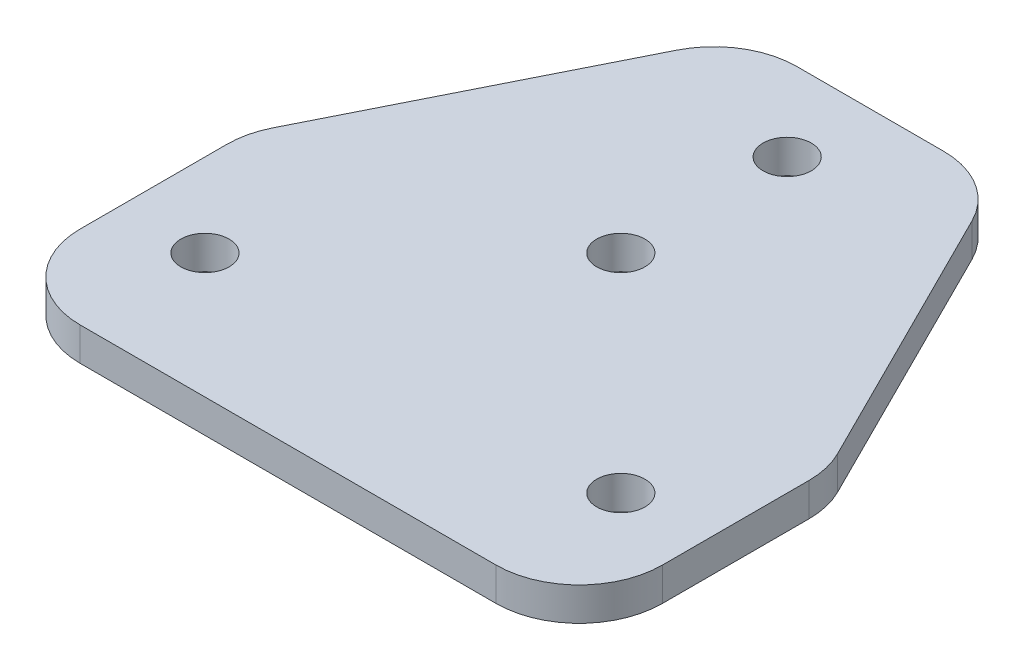
ISO-10303-21;
HEADER;
FILE_DESCRIPTION(('STEP AP214'),'2;1');
FILE_NAME('part.step','',(''),(''),'','','');
FILE_SCHEMA(('AUTOMOTIVE_DESIGN { 1 0 10303 214 1 1 1 1 }'));
ENDSEC;
DATA;
#1=APPLICATION_CONTEXT('core data for automotive mechanical design processes');
#2=APPLICATION_PROTOCOL_DEFINITION('international standard','automotive_design',2000,#1);
#3=PRODUCT_CONTEXT('',#1,'mechanical');
#4=PRODUCT('Part','Part','',(#3));
#5=PRODUCT_RELATED_PRODUCT_CATEGORY('part','',(#4));
#6=PRODUCT_DEFINITION_FORMATION('','',#4);
#7=PRODUCT_DEFINITION_CONTEXT('part definition',#1,'design');
#8=PRODUCT_DEFINITION('design','',#6,#7);
#9=PRODUCT_DEFINITION_SHAPE('','',#8);
#10=(LENGTH_UNIT() NAMED_UNIT(*) SI_UNIT(.MILLI.,.METRE.));
#11=(NAMED_UNIT(*) PLANE_ANGLE_UNIT() SI_UNIT($,.RADIAN.));
#12=(NAMED_UNIT(*) SI_UNIT($,.STERADIAN.) SOLID_ANGLE_UNIT());
#13=UNCERTAINTY_MEASURE_WITH_UNIT(LENGTH_MEASURE(1.E-05),#10,'distance_accuracy_value','');
#14=(GEOMETRIC_REPRESENTATION_CONTEXT(3) GLOBAL_UNCERTAINTY_ASSIGNED_CONTEXT((#13)) GLOBAL_UNIT_ASSIGNED_CONTEXT((#10,
#11,#12)) REPRESENTATION_CONTEXT('',''));
#15=CARTESIAN_POINT('',(0.,0.,0.));
#16=DIRECTION('',(0.,0.,1.));
#17=DIRECTION('',(1.,0.,0.));
#18=AXIS2_PLACEMENT_3D('',#15,#16,#17);
#19=CARTESIAN_POINT('',(0.,2.,0.));
#20=DIRECTION('',(0.,-1.,0.));
#21=DIRECTION('',(0.,0.,-1.));
#22=AXIS2_PLACEMENT_3D('',#19,#20,#21);
#23=PLANE('',#22);
#24=DIRECTION('',(0.,0.,1.));
#25=VECTOR('',#24,1.);
#26=CARTESIAN_POINT('',(-17.5,2.,7.5));
#27=LINE('',#26,#25);
#28=CARTESIAN_POINT('',(-17.5,2.,-6.31966011250105));
#29=VERTEX_POINT('',#28);
#30=CARTESIAN_POINT('',(-17.5,2.,2.5));
#31=VERTEX_POINT('',#30);
#32=EDGE_CURVE('E240',#29,#31,#27,.T.);
#33=ORIENTED_EDGE('',*,*,#32,.T.);
#34=CARTESIAN_POINT('',(-12.5,2.,2.5));
#35=DIRECTION('',(0.,-1.,0.));
#36=DIRECTION('',(0.,0.,-1.));
#37=AXIS2_PLACEMENT_3D('',#34,#35,#36);
#38=CIRCLE('',#37,5.);
#39=CARTESIAN_POINT('',(-12.5,2.,7.5));
#40=VERTEX_POINT('',#39);
#41=EDGE_CURVE('E191',#31,#40,#38,.F.);
#42=ORIENTED_EDGE('',*,*,#41,.T.);
#43=DIRECTION('',(1.,0.,0.));
#44=VECTOR('',#43,1.);
#45=CARTESIAN_POINT('',(17.5,2.,7.5));
#46=LINE('',#45,#44);
#47=CARTESIAN_POINT('',(12.5,2.,7.5));
#48=VERTEX_POINT('',#47);
#49=EDGE_CURVE('E153',#40,#48,#46,.T.);
#50=ORIENTED_EDGE('',*,*,#49,.T.);
#51=CARTESIAN_POINT('',(12.5,2.,2.5));
#52=DIRECTION('',(0.,-1.,0.));
#53=DIRECTION('',(0.,0.,-1.));
#54=AXIS2_PLACEMENT_3D('',#51,#52,#53);
#55=CIRCLE('',#54,5.);
#56=CARTESIAN_POINT('',(17.5,2.,2.5));
#57=VERTEX_POINT('',#56);
#58=EDGE_CURVE('E182',#48,#57,#55,.F.);
#59=ORIENTED_EDGE('',*,*,#58,.T.);
#60=DIRECTION('',(0.,0.,-1.));
#61=VECTOR('',#60,1.);
#62=CARTESIAN_POINT('',(17.5,2.,-7.5));
#63=LINE('',#62,#61);
#64=CARTESIAN_POINT('',(17.5,2.,-6.31966011250106));
#65=VERTEX_POINT('',#64);
#66=EDGE_CURVE('E160',#57,#65,#63,.T.);
#67=ORIENTED_EDGE('',*,*,#66,.T.);
#68=CARTESIAN_POINT('',(12.5,2.,-6.31966011250106));
#69=DIRECTION('',(0.,-1.,0.));
#70=DIRECTION('',(0.,0.,-1.));
#71=AXIS2_PLACEMENT_3D('',#68,#69,#70);
#72=CIRCLE('',#71,5.);
#73=CARTESIAN_POINT('',(16.9721359549996,2.,-8.55572809000084));
#74=VERTEX_POINT('',#73);
#75=EDGE_CURVE('E184',#65,#74,#72,.F.);
#76=ORIENTED_EDGE('',*,*,#75,.T.);
#77=DIRECTION('',(-0.447213595499958,0.,-0.894427190999916));
#78=VECTOR('',#77,1.);
#79=CARTESIAN_POINT('',(7.50000000000001,2.,-27.5));
#80=LINE('',#79,#78);
#81=CARTESIAN_POINT('',(8.88196601125011,2.,-24.7360679774998));
#82=VERTEX_POINT('',#81);
#83=EDGE_CURVE('E164',#74,#82,#80,.T.);
#84=ORIENTED_EDGE('',*,*,#83,.T.);
#85=CARTESIAN_POINT('',(4.40983005625053,2.,-22.5));
#86=DIRECTION('',(0.,-1.,0.));
#87=DIRECTION('',(0.,0.,-1.));
#88=AXIS2_PLACEMENT_3D('',#85,#86,#87);
#89=CIRCLE('',#88,5.);
#90=CARTESIAN_POINT('',(4.40983005625053,2.,-27.5));
#91=VERTEX_POINT('',#90);
#92=EDGE_CURVE('E186',#82,#91,#89,.F.);
#93=ORIENTED_EDGE('',*,*,#92,.T.);
#94=DIRECTION('',(-1.,0.,0.));
#95=VECTOR('',#94,1.);
#96=CARTESIAN_POINT('',(-7.49999999999999,2.,-27.5));
#97=LINE('',#96,#95);
#98=CARTESIAN_POINT('',(-4.40983005625052,2.,-27.5));
#99=VERTEX_POINT('',#98);
#100=EDGE_CURVE('E244',#91,#99,#97,.T.);
#101=ORIENTED_EDGE('',*,*,#100,.T.);
#102=CARTESIAN_POINT('',(-4.40983005625052,2.,-22.5));
#103=DIRECTION('',(0.,-1.,0.));
#104=DIRECTION('',(0.,0.,-1.));
#105=AXIS2_PLACEMENT_3D('',#102,#103,#104);
#106=CIRCLE('',#105,5.);
#107=CARTESIAN_POINT('',(-8.8819660112501,2.,-24.7360679774998));
#108=VERTEX_POINT('',#107);
#109=EDGE_CURVE('E65',#99,#108,#106,.F.);
#110=ORIENTED_EDGE('',*,*,#109,.T.);
#111=DIRECTION('',(-0.447213595499959,0.,0.894427190999916));
#112=VECTOR('',#111,1.);
#113=CARTESIAN_POINT('',(-17.5,2.,-7.5));
#114=LINE('',#113,#112);
#115=CARTESIAN_POINT('',(-16.9721359549996,2.,-8.55572809000085));
#116=VERTEX_POINT('',#115);
#117=EDGE_CURVE('E241',#108,#116,#114,.T.);
#118=ORIENTED_EDGE('',*,*,#117,.T.);
#119=CARTESIAN_POINT('',(-12.5,2.,-6.31966011250105));
#120=DIRECTION('',(0.,-1.,0.));
#121=DIRECTION('',(0.,0.,-1.));
#122=AXIS2_PLACEMENT_3D('',#119,#120,#121);
#123=CIRCLE('',#122,5.);
#124=EDGE_CURVE('E189',#116,#29,#123,.F.);
#125=ORIENTED_EDGE('',*,*,#124,.T.);
#126=EDGE_LOOP('',(#33,#42,#50,#59,#67,#76,#84,#93,#101,#110,#118,#125));
#127=FACE_BOUND('',#126,.T.);
#128=CARTESIAN_POINT('',(12.5,2.,0.));
#129=DIRECTION('',(0.,1.,0.));
#130=DIRECTION('',(0.,0.,1.));
#131=AXIS2_PLACEMENT_3D('',#128,#129,#130);
#132=CIRCLE('',#131,1.45);
#133=CARTESIAN_POINT('',(12.5,2.,1.45));
#134=VERTEX_POINT('',#133);
#135=EDGE_CURVE('E218',#134,#134,#132,.T.);
#136=ORIENTED_EDGE('',*,*,#135,.F.);
#137=EDGE_LOOP('',(#136));
#138=FACE_BOUND('',#137,.T.);
#139=CARTESIAN_POINT('',(0.,2.,-12.5));
#140=DIRECTION('',(0.,1.,0.));
#141=DIRECTION('',(0.,0.,1.));
#142=AXIS2_PLACEMENT_3D('',#139,#140,#141);
#143=CIRCLE('',#142,1.45);
#144=CARTESIAN_POINT('',(0.,2.,-11.05));
#145=VERTEX_POINT('',#144);
#146=EDGE_CURVE('E251',#145,#145,#143,.T.);
#147=ORIENTED_EDGE('',*,*,#146,.F.);
#148=EDGE_LOOP('',(#147));
#149=FACE_BOUND('',#148,.T.);
#150=CARTESIAN_POINT('',(0.,2.,-22.5));
#151=DIRECTION('',(0.,1.,0.));
#152=DIRECTION('',(0.,0.,1.));
#153=AXIS2_PLACEMENT_3D('',#150,#151,#152);
#154=CIRCLE('',#153,1.45);
#155=CARTESIAN_POINT('',(0.,2.,-21.05));
#156=VERTEX_POINT('',#155);
#157=EDGE_CURVE('E256',#156,#156,#154,.T.);
#158=ORIENTED_EDGE('',*,*,#157,.F.);
#159=EDGE_LOOP('',(#158));
#160=FACE_BOUND('',#159,.T.);
#161=CARTESIAN_POINT('',(-12.5,2.,0.));
#162=DIRECTION('',(0.,1.,0.));
#163=DIRECTION('',(0.,0.,-1.));
#164=AXIS2_PLACEMENT_3D('',#161,#162,#163);
#165=CIRCLE('',#164,1.45);
#166=CARTESIAN_POINT('',(-12.5,2.,-1.45));
#167=VERTEX_POINT('',#166);
#168=EDGE_CURVE('E262',#167,#167,#165,.T.);
#169=ORIENTED_EDGE('',*,*,#168,.F.);
#170=EDGE_LOOP('',(#169));
#171=FACE_BOUND('',#170,.T.);
#172=ADVANCED_FACE('F43',(#127,#138,#149,#160,#171),#23,.F.);
#173=CARTESIAN_POINT('',(0.,0.,0.));
#174=DIRECTION('',(0.,-1.,0.));
#175=DIRECTION('',(0.,0.,-1.));
#176=AXIS2_PLACEMENT_3D('',#173,#174,#175);
#177=PLANE('',#176);
#178=CARTESIAN_POINT('',(0.,0.,-22.5));
#179=DIRECTION('',(0.,1.,0.));
#180=DIRECTION('',(0.,0.,1.));
#181=AXIS2_PLACEMENT_3D('',#178,#179,#180);
#182=CIRCLE('',#181,1.45);
#183=CARTESIAN_POINT('',(0.,0.,-21.05));
#184=VERTEX_POINT('',#183);
#185=EDGE_CURVE('E259',#184,#184,#182,.T.);
#186=ORIENTED_EDGE('',*,*,#185,.T.);
#187=EDGE_LOOP('',(#186));
#188=FACE_BOUND('',#187,.T.);
#189=CARTESIAN_POINT('',(12.5,0.,0.));
#190=DIRECTION('',(0.,1.,0.));
#191=DIRECTION('',(0.,0.,1.));
#192=AXIS2_PLACEMENT_3D('',#189,#190,#191);
#193=CIRCLE('',#192,1.45);
#194=CARTESIAN_POINT('',(12.5,0.,1.45));
#195=VERTEX_POINT('',#194);
#196=EDGE_CURVE('E224',#195,#195,#193,.T.);
#197=ORIENTED_EDGE('',*,*,#196,.T.);
#198=EDGE_LOOP('',(#197));
#199=FACE_BOUND('',#198,.T.);
#200=DIRECTION('',(1.,0.,0.));
#201=VECTOR('',#200,1.);
#202=CARTESIAN_POINT('',(17.5,0.,7.5));
#203=LINE('',#202,#201);
#204=CARTESIAN_POINT('',(-12.5,0.,7.5));
#205=VERTEX_POINT('',#204);
#206=CARTESIAN_POINT('',(12.5,0.,7.5));
#207=VERTEX_POINT('',#206);
#208=EDGE_CURVE('E150',#205,#207,#203,.T.);
#209=ORIENTED_EDGE('',*,*,#208,.F.);
#210=CARTESIAN_POINT('',(-12.5,0.,2.5));
#211=DIRECTION('',(0.,-1.,0.));
#212=DIRECTION('',(0.,0.,-1.));
#213=AXIS2_PLACEMENT_3D('',#210,#211,#212);
#214=CIRCLE('',#213,5.);
#215=CARTESIAN_POINT('',(-17.5,0.,2.5));
#216=VERTEX_POINT('',#215);
#217=EDGE_CURVE('E133',#205,#216,#214,.T.);
#218=ORIENTED_EDGE('',*,*,#217,.T.);
#219=DIRECTION('',(0.,0.,1.));
#220=VECTOR('',#219,1.);
#221=CARTESIAN_POINT('',(-17.5,0.,7.5));
#222=LINE('',#221,#220);
#223=CARTESIAN_POINT('',(-17.5,0.,-6.31966011250105));
#224=VERTEX_POINT('',#223);
#225=EDGE_CURVE('E161',#224,#216,#222,.T.);
#226=ORIENTED_EDGE('',*,*,#225,.F.);
#227=CARTESIAN_POINT('',(-12.5,0.,-6.31966011250105));
#228=DIRECTION('',(0.,-1.,0.));
#229=DIRECTION('',(0.,0.,-1.));
#230=AXIS2_PLACEMENT_3D('',#227,#228,#229);
#231=CIRCLE('',#230,5.);
#232=CARTESIAN_POINT('',(-16.9721359549996,0.,-8.55572809000085));
#233=VERTEX_POINT('',#232);
#234=EDGE_CURVE('E144',#224,#233,#231,.T.);
#235=ORIENTED_EDGE('',*,*,#234,.T.);
#236=DIRECTION('',(-0.447213595499959,0.,0.894427190999916));
#237=VECTOR('',#236,1.);
#238=CARTESIAN_POINT('',(-17.5,0.,-7.5));
#239=LINE('',#238,#237);
#240=CARTESIAN_POINT('',(-8.8819660112501,0.,-24.7360679774998));
#241=VERTEX_POINT('',#240);
#242=EDGE_CURVE('E166',#241,#233,#239,.T.);
#243=ORIENTED_EDGE('',*,*,#242,.F.);
#244=CARTESIAN_POINT('',(-4.40983005625052,0.,-22.5));
#245=DIRECTION('',(0.,-1.,0.));
#246=DIRECTION('',(0.,0.,-1.));
#247=AXIS2_PLACEMENT_3D('',#244,#245,#246);
#248=CIRCLE('',#247,5.);
#249=CARTESIAN_POINT('',(-4.40983005625052,0.,-27.5));
#250=VERTEX_POINT('',#249);
#251=EDGE_CURVE('E176',#241,#250,#248,.T.);
#252=ORIENTED_EDGE('',*,*,#251,.T.);
#253=DIRECTION('',(-1.,0.,0.));
#254=VECTOR('',#253,1.);
#255=CARTESIAN_POINT('',(-7.49999999999999,0.,-27.5));
#256=LINE('',#255,#254);
#257=CARTESIAN_POINT('',(4.40983005625053,0.,-27.5));
#258=VERTEX_POINT('',#257);
#259=EDGE_CURVE('E221',#258,#250,#256,.T.);
#260=ORIENTED_EDGE('',*,*,#259,.F.);
#261=CARTESIAN_POINT('',(4.40983005625053,0.,-22.5));
#262=DIRECTION('',(0.,-1.,0.));
#263=DIRECTION('',(0.,0.,-1.));
#264=AXIS2_PLACEMENT_3D('',#261,#262,#263);
#265=CIRCLE('',#264,5.);
#266=CARTESIAN_POINT('',(8.88196601125011,0.,-24.7360679774998));
#267=VERTEX_POINT('',#266);
#268=EDGE_CURVE('E174',#258,#267,#265,.T.);
#269=ORIENTED_EDGE('',*,*,#268,.T.);
#270=DIRECTION('',(-0.447213595499958,0.,-0.894427190999916));
#271=VECTOR('',#270,1.);
#272=CARTESIAN_POINT('',(7.50000000000001,0.,-27.5));
#273=LINE('',#272,#271);
#274=CARTESIAN_POINT('',(16.9721359549996,0.,-8.55572809000084));
#275=VERTEX_POINT('',#274);
#276=EDGE_CURVE('E217',#275,#267,#273,.T.);
#277=ORIENTED_EDGE('',*,*,#276,.F.);
#278=CARTESIAN_POINT('',(12.5,0.,-6.31966011250106));
#279=DIRECTION('',(0.,-1.,0.));
#280=DIRECTION('',(0.,0.,-1.));
#281=AXIS2_PLACEMENT_3D('',#278,#279,#280);
#282=CIRCLE('',#281,5.);
#283=CARTESIAN_POINT('',(17.5,0.,-6.31966011250106));
#284=VERTEX_POINT('',#283);
#285=EDGE_CURVE('E172',#275,#284,#282,.T.);
#286=ORIENTED_EDGE('',*,*,#285,.T.);
#287=DIRECTION('',(0.,0.,-1.));
#288=VECTOR('',#287,1.);
#289=CARTESIAN_POINT('',(17.5,0.,-7.5));
#290=LINE('',#289,#288);
#291=CARTESIAN_POINT('',(17.5,0.,2.5));
#292=VERTEX_POINT('',#291);
#293=EDGE_CURVE('E212',#292,#284,#290,.T.);
#294=ORIENTED_EDGE('',*,*,#293,.F.);
#295=CARTESIAN_POINT('',(12.5,0.,2.5));
#296=DIRECTION('',(0.,-1.,0.));
#297=DIRECTION('',(0.,0.,-1.));
#298=AXIS2_PLACEMENT_3D('',#295,#296,#297);
#299=CIRCLE('',#298,5.);
#300=EDGE_CURVE('E154',#292,#207,#299,.T.);
#301=ORIENTED_EDGE('',*,*,#300,.T.);
#302=EDGE_LOOP('',(#209,#218,#226,#235,#243,#252,#260,#269,#277,#286,#294,#301));
#303=FACE_BOUND('',#302,.T.);
#304=CARTESIAN_POINT('',(0.,0.,-12.5));
#305=DIRECTION('',(0.,1.,0.));
#306=DIRECTION('',(0.,0.,1.));
#307=AXIS2_PLACEMENT_3D('',#304,#305,#306);
#308=CIRCLE('',#307,1.45);
#309=CARTESIAN_POINT('',(0.,0.,-11.05));
#310=VERTEX_POINT('',#309);
#311=EDGE_CURVE('E253',#310,#310,#308,.T.);
#312=ORIENTED_EDGE('',*,*,#311,.T.);
#313=EDGE_LOOP('',(#312));
#314=FACE_BOUND('',#313,.T.);
#315=CARTESIAN_POINT('',(-12.5,0.,0.));
#316=DIRECTION('',(0.,1.,0.));
#317=DIRECTION('',(0.,0.,-1.));
#318=AXIS2_PLACEMENT_3D('',#315,#316,#317);
#319=CIRCLE('',#318,1.45);
#320=CARTESIAN_POINT('',(-12.5,0.,-1.45));
#321=VERTEX_POINT('',#320);
#322=EDGE_CURVE('E265',#321,#321,#319,.T.);
#323=ORIENTED_EDGE('',*,*,#322,.T.);
#324=EDGE_LOOP('',(#323));
#325=FACE_BOUND('',#324,.T.);
#326=ADVANCED_FACE('F157',(#188,#199,#303,#314,#325),#177,.T.);
#327=CARTESIAN_POINT('',(17.5,2.,-7.5));
#328=DIRECTION('',(-1.,0.,0.));
#329=DIRECTION('',(0.,0.,1.));
#330=AXIS2_PLACEMENT_3D('',#327,#328,#329);
#331=PLANE('',#330);
#332=ORIENTED_EDGE('',*,*,#293,.T.);
#333=DIRECTION('',(0.,-1.,0.));
#334=VECTOR('',#333,1.);
#335=CARTESIAN_POINT('',(17.5,2.,-6.31966011250106));
#336=LINE('',#335,#334);
#337=EDGE_CURVE('E11',#284,#65,#336,.F.);
#338=ORIENTED_EDGE('',*,*,#337,.T.);
#339=ORIENTED_EDGE('',*,*,#66,.F.);
#340=DIRECTION('',(0.,-1.,0.));
#341=VECTOR('',#340,1.);
#342=CARTESIAN_POINT('',(17.5,2.,2.5));
#343=LINE('',#342,#341);
#344=EDGE_CURVE('E51',#57,#292,#343,.T.);
#345=ORIENTED_EDGE('',*,*,#344,.T.);
#346=EDGE_LOOP('',(#332,#338,#339,#345));
#347=FACE_BOUND('',#346,.T.);
#348=ADVANCED_FACE('F211',(#347),#331,.F.);
#349=CARTESIAN_POINT('',(7.50000000000001,2.,-27.5));
#350=DIRECTION('',(-0.894427190999916,0.,0.447213595499958));
#351=DIRECTION('',(0.447213595499958,0.,0.894427190999916));
#352=AXIS2_PLACEMENT_3D('',#349,#350,#351);
#353=PLANE('',#352);
#354=ORIENTED_EDGE('',*,*,#276,.T.);
#355=DIRECTION('',(0.,-1.,0.));
#356=VECTOR('',#355,1.);
#357=CARTESIAN_POINT('',(8.88196601125011,2.,-24.7360679774998));
#358=LINE('',#357,#356);
#359=EDGE_CURVE('E205',#267,#82,#358,.F.);
#360=ORIENTED_EDGE('',*,*,#359,.T.);
#361=ORIENTED_EDGE('',*,*,#83,.F.);
#362=DIRECTION('',(0.,-1.,0.));
#363=VECTOR('',#362,1.);
#364=CARTESIAN_POINT('',(16.9721359549996,2.,-8.55572809000085));
#365=LINE('',#364,#363);
#366=EDGE_CURVE('E202',#74,#275,#365,.T.);
#367=ORIENTED_EDGE('',*,*,#366,.T.);
#368=EDGE_LOOP('',(#354,#360,#361,#367));
#369=FACE_BOUND('',#368,.T.);
#370=ADVANCED_FACE('F295',(#369),#353,.F.);
#371=CARTESIAN_POINT('',(-7.49999999999999,2.,-27.5));
#372=DIRECTION('',(0.,0.,1.));
#373=DIRECTION('',(1.,0.,0.));
#374=AXIS2_PLACEMENT_3D('',#371,#372,#373);
#375=PLANE('',#374);
#376=ORIENTED_EDGE('',*,*,#259,.T.);
#377=DIRECTION('',(0.,-1.,0.));
#378=VECTOR('',#377,1.);
#379=CARTESIAN_POINT('',(-4.40983005625052,2.,-27.5));
#380=LINE('',#379,#378);
#381=EDGE_CURVE('E200',#250,#99,#380,.F.);
#382=ORIENTED_EDGE('',*,*,#381,.T.);
#383=ORIENTED_EDGE('',*,*,#100,.F.);
#384=DIRECTION('',(0.,-1.,0.));
#385=VECTOR('',#384,1.);
#386=CARTESIAN_POINT('',(4.40983005625053,2.,-27.5));
#387=LINE('',#386,#385);
#388=EDGE_CURVE('E197',#91,#258,#387,.T.);
#389=ORIENTED_EDGE('',*,*,#388,.T.);
#390=EDGE_LOOP('',(#376,#382,#383,#389));
#391=FACE_BOUND('',#390,.T.);
#392=ADVANCED_FACE('F292',(#391),#375,.F.);
#393=CARTESIAN_POINT('',(-17.5,2.,-7.5));
#394=DIRECTION('',(0.894427190999916,0.,0.447213595499959));
#395=DIRECTION('',(0.447213595499959,0.,-0.894427190999916));
#396=AXIS2_PLACEMENT_3D('',#393,#394,#395);
#397=PLANE('',#396);
#398=ORIENTED_EDGE('',*,*,#242,.T.);
#399=DIRECTION('',(0.,-1.,0.));
#400=VECTOR('',#399,1.);
#401=CARTESIAN_POINT('',(-16.9721359549996,2.,-8.55572809000085));
#402=LINE('',#401,#400);
#403=EDGE_CURVE('E58',#233,#116,#402,.F.);
#404=ORIENTED_EDGE('',*,*,#403,.T.);
#405=ORIENTED_EDGE('',*,*,#117,.F.);
#406=DIRECTION('',(0.,-1.,0.));
#407=VECTOR('',#406,1.);
#408=CARTESIAN_POINT('',(-8.8819660112501,2.,-24.7360679774998));
#409=LINE('',#408,#407);
#410=EDGE_CURVE('E193',#108,#241,#409,.T.);
#411=ORIENTED_EDGE('',*,*,#410,.T.);
#412=EDGE_LOOP('',(#398,#404,#405,#411));
#413=FACE_BOUND('',#412,.T.);
#414=ADVANCED_FACE('F231',(#413),#397,.F.);
#415=CARTESIAN_POINT('',(-17.5,2.,7.5));
#416=DIRECTION('',(1.,0.,0.));
#417=DIRECTION('',(0.,0.,-1.));
#418=AXIS2_PLACEMENT_3D('',#415,#416,#417);
#419=PLANE('',#418);
#420=ORIENTED_EDGE('',*,*,#225,.T.);
#421=DIRECTION('',(0.,-1.,0.));
#422=VECTOR('',#421,1.);
#423=CARTESIAN_POINT('',(-17.5,2.,2.5));
#424=LINE('',#423,#422);
#425=EDGE_CURVE('E138',#216,#31,#424,.F.);
#426=ORIENTED_EDGE('',*,*,#425,.T.);
#427=ORIENTED_EDGE('',*,*,#32,.F.);
#428=DIRECTION('',(0.,-1.,0.));
#429=VECTOR('',#428,1.);
#430=CARTESIAN_POINT('',(-17.5,2.,-6.31966011250105));
#431=LINE('',#430,#429);
#432=EDGE_CURVE('E143',#29,#224,#431,.T.);
#433=ORIENTED_EDGE('',*,*,#432,.T.);
#434=EDGE_LOOP('',(#420,#426,#427,#433));
#435=FACE_BOUND('',#434,.T.);
#436=ADVANCED_FACE('F243',(#435),#419,.F.);
#437=CARTESIAN_POINT('',(17.5,2.,7.5));
#438=DIRECTION('',(0.,0.,-1.));
#439=DIRECTION('',(-1.,0.,0.));
#440=AXIS2_PLACEMENT_3D('',#437,#438,#439);
#441=PLANE('',#440);
#442=ORIENTED_EDGE('',*,*,#49,.F.);
#443=DIRECTION('',(0.,-1.,0.));
#444=VECTOR('',#443,1.);
#445=CARTESIAN_POINT('',(-12.5,2.,7.5));
#446=LINE('',#445,#444);
#447=EDGE_CURVE('E137',#40,#205,#446,.T.);
#448=ORIENTED_EDGE('',*,*,#447,.T.);
#449=ORIENTED_EDGE('',*,*,#208,.T.);
#450=DIRECTION('',(0.,-1.,0.));
#451=VECTOR('',#450,1.);
#452=CARTESIAN_POINT('',(12.5,2.,7.5));
#453=LINE('',#452,#451);
#454=EDGE_CURVE('E155',#207,#48,#453,.F.);
#455=ORIENTED_EDGE('',*,*,#454,.T.);
#456=EDGE_LOOP('',(#442,#448,#449,#455));
#457=FACE_BOUND('',#456,.T.);
#458=ADVANCED_FACE('F149',(#457),#441,.F.);
#459=CARTESIAN_POINT('',(12.5,2.,0.));
#460=DIRECTION('',(0.,-1.,0.));
#461=DIRECTION('',(0.,0.,-1.));
#462=AXIS2_PLACEMENT_3D('',#459,#460,#461);
#463=CYLINDRICAL_SURFACE('',#462,1.45);
#464=ORIENTED_EDGE('',*,*,#135,.T.);
#465=EDGE_LOOP('',(#464));
#466=FACE_BOUND('',#465,.T.);
#467=ORIENTED_EDGE('',*,*,#196,.F.);
#468=EDGE_LOOP('',(#467));
#469=FACE_BOUND('',#468,.T.);
#470=ADVANCED_FACE('F283',(#466,#469),#463,.F.);
#471=CARTESIAN_POINT('',(0.,2.,-12.5));
#472=DIRECTION('',(0.,-1.,0.));
#473=DIRECTION('',(0.,0.,-1.));
#474=AXIS2_PLACEMENT_3D('',#471,#472,#473);
#475=CYLINDRICAL_SURFACE('',#474,1.45);
#476=ORIENTED_EDGE('',*,*,#146,.T.);
#477=EDGE_LOOP('',(#476));
#478=FACE_BOUND('',#477,.T.);
#479=ORIENTED_EDGE('',*,*,#311,.F.);
#480=EDGE_LOOP('',(#479));
#481=FACE_BOUND('',#480,.T.);
#482=ADVANCED_FACE('F376',(#478,#481),#475,.F.);
#483=CARTESIAN_POINT('',(0.,2.,-22.5));
#484=DIRECTION('',(0.,-1.,0.));
#485=DIRECTION('',(0.,0.,-1.));
#486=AXIS2_PLACEMENT_3D('',#483,#484,#485);
#487=CYLINDRICAL_SURFACE('',#486,1.45);
#488=ORIENTED_EDGE('',*,*,#157,.T.);
#489=EDGE_LOOP('',(#488));
#490=FACE_BOUND('',#489,.T.);
#491=ORIENTED_EDGE('',*,*,#185,.F.);
#492=EDGE_LOOP('',(#491));
#493=FACE_BOUND('',#492,.T.);
#494=ADVANCED_FACE('F367',(#490,#493),#487,.F.);
#495=CARTESIAN_POINT('',(-12.5,2.,0.));
#496=DIRECTION('',(0.,-1.,0.));
#497=DIRECTION('',(0.,0.,-1.));
#498=AXIS2_PLACEMENT_3D('',#495,#496,#497);
#499=CYLINDRICAL_SURFACE('',#498,1.45);
#500=ORIENTED_EDGE('',*,*,#168,.T.);
#501=EDGE_LOOP('',(#500));
#502=FACE_BOUND('',#501,.T.);
#503=ORIENTED_EDGE('',*,*,#322,.F.);
#504=EDGE_LOOP('',(#503));
#505=FACE_BOUND('',#504,.T.);
#506=ADVANCED_FACE('F271',(#502,#505),#499,.F.);
#507=CARTESIAN_POINT('',(-12.5,2.,2.5));
#508=DIRECTION('',(0.,-1.,0.));
#509=DIRECTION('',(0.,0.,-1.));
#510=AXIS2_PLACEMENT_3D('',#507,#508,#509);
#511=CYLINDRICAL_SURFACE('',#510,5.);
#512=ORIENTED_EDGE('',*,*,#41,.F.);
#513=ORIENTED_EDGE('',*,*,#425,.F.);
#514=ORIENTED_EDGE('',*,*,#217,.F.);
#515=ORIENTED_EDGE('',*,*,#447,.F.);
#516=EDGE_LOOP('',(#512,#513,#514,#515));
#517=FACE_BOUND('',#516,.T.);
#518=ADVANCED_FACE('F136',(#517),#511,.T.);
#519=CARTESIAN_POINT('',(-12.5,2.,-6.31966011250105));
#520=DIRECTION('',(0.,-1.,0.));
#521=DIRECTION('',(0.,0.,-1.));
#522=AXIS2_PLACEMENT_3D('',#519,#520,#521);
#523=CYLINDRICAL_SURFACE('',#522,5.);
#524=ORIENTED_EDGE('',*,*,#124,.F.);
#525=ORIENTED_EDGE('',*,*,#403,.F.);
#526=ORIENTED_EDGE('',*,*,#234,.F.);
#527=ORIENTED_EDGE('',*,*,#432,.F.);
#528=EDGE_LOOP('',(#524,#525,#526,#527));
#529=FACE_BOUND('',#528,.T.);
#530=ADVANCED_FACE('F235',(#529),#523,.T.);
#531=CARTESIAN_POINT('',(-4.40983005625052,2.,-22.5));
#532=DIRECTION('',(0.,-1.,0.));
#533=DIRECTION('',(0.,0.,-1.));
#534=AXIS2_PLACEMENT_3D('',#531,#532,#533);
#535=CYLINDRICAL_SURFACE('',#534,5.);
#536=ORIENTED_EDGE('',*,*,#109,.F.);
#537=ORIENTED_EDGE('',*,*,#381,.F.);
#538=ORIENTED_EDGE('',*,*,#251,.F.);
#539=ORIENTED_EDGE('',*,*,#410,.F.);
#540=EDGE_LOOP('',(#536,#537,#538,#539));
#541=FACE_BOUND('',#540,.T.);
#542=ADVANCED_FACE('F306',(#541),#535,.T.);
#543=CARTESIAN_POINT('',(4.40983005625053,2.,-22.5));
#544=DIRECTION('',(0.,-1.,0.));
#545=DIRECTION('',(0.,0.,-1.));
#546=AXIS2_PLACEMENT_3D('',#543,#544,#545);
#547=CYLINDRICAL_SURFACE('',#546,5.);
#548=ORIENTED_EDGE('',*,*,#92,.F.);
#549=ORIENTED_EDGE('',*,*,#359,.F.);
#550=ORIENTED_EDGE('',*,*,#268,.F.);
#551=ORIENTED_EDGE('',*,*,#388,.F.);
#552=EDGE_LOOP('',(#548,#549,#550,#551));
#553=FACE_BOUND('',#552,.T.);
#554=ADVANCED_FACE('F309',(#553),#547,.T.);
#555=CARTESIAN_POINT('',(12.5,2.,-6.31966011250106));
#556=DIRECTION('',(0.,-1.,0.));
#557=DIRECTION('',(0.,0.,-1.));
#558=AXIS2_PLACEMENT_3D('',#555,#556,#557);
#559=CYLINDRICAL_SURFACE('',#558,5.);
#560=ORIENTED_EDGE('',*,*,#75,.F.);
#561=ORIENTED_EDGE('',*,*,#337,.F.);
#562=ORIENTED_EDGE('',*,*,#285,.F.);
#563=ORIENTED_EDGE('',*,*,#366,.F.);
#564=EDGE_LOOP('',(#560,#561,#562,#563));
#565=FACE_BOUND('',#564,.T.);
#566=ADVANCED_FACE('F312',(#565),#559,.T.);
#567=CARTESIAN_POINT('',(12.5,2.,2.5));
#568=DIRECTION('',(0.,-1.,0.));
#569=DIRECTION('',(0.,0.,-1.));
#570=AXIS2_PLACEMENT_3D('',#567,#568,#569);
#571=CYLINDRICAL_SURFACE('',#570,5.);
#572=ORIENTED_EDGE('',*,*,#58,.F.);
#573=ORIENTED_EDGE('',*,*,#454,.F.);
#574=ORIENTED_EDGE('',*,*,#300,.F.);
#575=ORIENTED_EDGE('',*,*,#344,.F.);
#576=EDGE_LOOP('',(#572,#573,#574,#575));
#577=FACE_BOUND('',#576,.T.);
#578=ADVANCED_FACE('F45',(#577),#571,.T.);
#579=CLOSED_SHELL('',(#172,#326,#348,#370,#392,#414,#436,#458,#470,#482,#494,#506,#518,#530,
#542,#554,#566,#578));
#580=MANIFOLD_SOLID_BREP('B2',#579);
#581=ADVANCED_BREP_SHAPE_REPRESENTATION('',(#18,#580),#14);
#582=SHAPE_DEFINITION_REPRESENTATION(#9,#581);
ENDSEC;
END-ISO-10303-21;
